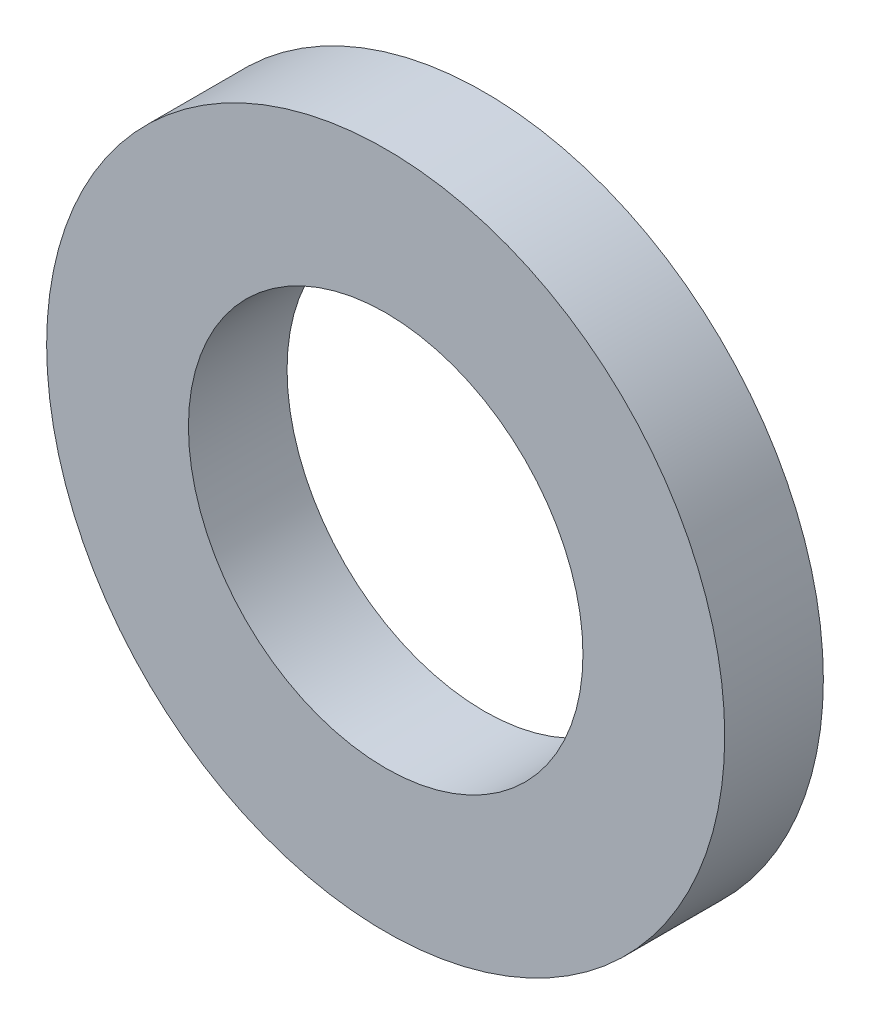
ISO-10303-21;
HEADER;
FILE_DESCRIPTION(('STEP AP214'),'2;1');
FILE_NAME('part.step','',(''),(''),'','','');
FILE_SCHEMA(('AUTOMOTIVE_DESIGN { 1 0 10303 214 1 1 1 1 }'));
ENDSEC;
DATA;
#1=APPLICATION_CONTEXT('core data for automotive mechanical design processes');
#2=APPLICATION_PROTOCOL_DEFINITION('international standard','automotive_design',2000,#1);
#3=PRODUCT_CONTEXT('',#1,'mechanical');
#4=PRODUCT('Part','Part','',(#3));
#5=PRODUCT_RELATED_PRODUCT_CATEGORY('part','',(#4));
#6=PRODUCT_DEFINITION_FORMATION('','',#4);
#7=PRODUCT_DEFINITION_CONTEXT('part definition',#1,'design');
#8=PRODUCT_DEFINITION('design','',#6,#7);
#9=PRODUCT_DEFINITION_SHAPE('','',#8);
#10=(LENGTH_UNIT() NAMED_UNIT(*) SI_UNIT(.MILLI.,.METRE.));
#11=(NAMED_UNIT(*) PLANE_ANGLE_UNIT() SI_UNIT($,.RADIAN.));
#12=(NAMED_UNIT(*) SI_UNIT($,.STERADIAN.) SOLID_ANGLE_UNIT());
#13=UNCERTAINTY_MEASURE_WITH_UNIT(LENGTH_MEASURE(1.E-05),#10,'distance_accuracy_value','');
#14=(GEOMETRIC_REPRESENTATION_CONTEXT(3) GLOBAL_UNCERTAINTY_ASSIGNED_CONTEXT((#13)) GLOBAL_UNIT_ASSIGNED_CONTEXT((#10,
#11,#12)) REPRESENTATION_CONTEXT('',''));
#15=CARTESIAN_POINT('',(0.,0.,0.));
#16=DIRECTION('',(0.,0.,1.));
#17=DIRECTION('',(1.,0.,0.));
#18=AXIS2_PLACEMENT_3D('',#15,#16,#17);
#19=CARTESIAN_POINT('',(0.,0.,1.6));
#20=DIRECTION('',(0.,0.,1.));
#21=DIRECTION('',(1.,0.,0.));
#22=AXIS2_PLACEMENT_3D('',#19,#20,#21);
#23=PLANE('',#22);
#24=CARTESIAN_POINT('',(0.,0.,1.6));
#25=DIRECTION('',(0.,0.,1.));
#26=DIRECTION('',(1.,0.,0.));
#27=AXIS2_PLACEMENT_3D('',#24,#25,#26);
#28=CIRCLE('',#27,5.5);
#29=CARTESIAN_POINT('',(5.5,0.,1.6));
#30=VERTEX_POINT('',#29);
#31=EDGE_CURVE('E10',#30,#30,#28,.T.);
#32=ORIENTED_EDGE('',*,*,#31,.T.);
#33=EDGE_LOOP('',(#32));
#34=FACE_BOUND('',#33,.T.);
#35=CARTESIAN_POINT('',(0.,0.,1.6));
#36=DIRECTION('',(0.,0.,1.));
#37=DIRECTION('',(1.,0.,0.));
#38=AXIS2_PLACEMENT_3D('',#35,#36,#37);
#39=CIRCLE('',#38,3.2);
#40=CARTESIAN_POINT('',(3.2,0.,1.6));
#41=VERTEX_POINT('',#40);
#42=EDGE_CURVE('E39',#41,#41,#39,.T.);
#43=ORIENTED_EDGE('',*,*,#42,.F.);
#44=EDGE_LOOP('',(#43));
#45=FACE_BOUND('',#44,.T.);
#46=ADVANCED_FACE('F28',(#34,#45),#23,.T.);
#47=CARTESIAN_POINT('',(0.,0.,0.));
#48=DIRECTION('',(0.,0.,1.));
#49=DIRECTION('',(1.,0.,0.));
#50=AXIS2_PLACEMENT_3D('',#47,#48,#49);
#51=PLANE('',#50);
#52=CARTESIAN_POINT('',(0.,0.,0.));
#53=DIRECTION('',(0.,0.,1.));
#54=DIRECTION('',(1.,0.,0.));
#55=AXIS2_PLACEMENT_3D('',#52,#53,#54);
#56=CIRCLE('',#55,5.5);
#57=CARTESIAN_POINT('',(5.5,0.,0.));
#58=VERTEX_POINT('',#57);
#59=EDGE_CURVE('E32',#58,#58,#56,.T.);
#60=ORIENTED_EDGE('',*,*,#59,.F.);
#61=EDGE_LOOP('',(#60));
#62=FACE_BOUND('',#61,.T.);
#63=CARTESIAN_POINT('',(0.,0.,0.));
#64=DIRECTION('',(0.,0.,1.));
#65=DIRECTION('',(1.,0.,0.));
#66=AXIS2_PLACEMENT_3D('',#63,#64,#65);
#67=CIRCLE('',#66,3.2);
#68=CARTESIAN_POINT('',(3.2,0.,0.));
#69=VERTEX_POINT('',#68);
#70=EDGE_CURVE('E41',#69,#69,#67,.T.);
#71=ORIENTED_EDGE('',*,*,#70,.T.);
#72=EDGE_LOOP('',(#71));
#73=FACE_BOUND('',#72,.T.);
#74=ADVANCED_FACE('F51',(#62,#73),#51,.F.);
#75=CARTESIAN_POINT('',(0.,0.,1.6));
#76=DIRECTION('',(0.,0.,-1.));
#77=DIRECTION('',(-1.,0.,0.));
#78=AXIS2_PLACEMENT_3D('',#75,#76,#77);
#79=CYLINDRICAL_SURFACE('',#78,5.5);
#80=ORIENTED_EDGE('',*,*,#31,.F.);
#81=EDGE_LOOP('',(#80));
#82=FACE_BOUND('',#81,.T.);
#83=ORIENTED_EDGE('',*,*,#59,.T.);
#84=EDGE_LOOP('',(#83));
#85=FACE_BOUND('',#84,.T.);
#86=ADVANCED_FACE('F30',(#82,#85),#79,.T.);
#87=CARTESIAN_POINT('',(0.,0.,1.6));
#88=DIRECTION('',(0.,0.,-1.));
#89=DIRECTION('',(-1.,0.,0.));
#90=AXIS2_PLACEMENT_3D('',#87,#88,#89);
#91=CYLINDRICAL_SURFACE('',#90,3.2);
#92=ORIENTED_EDGE('',*,*,#42,.T.);
#93=EDGE_LOOP('',(#92));
#94=FACE_BOUND('',#93,.T.);
#95=ORIENTED_EDGE('',*,*,#70,.F.);
#96=EDGE_LOOP('',(#95));
#97=FACE_BOUND('',#96,.T.);
#98=ADVANCED_FACE('F47',(#94,#97),#91,.F.);
#99=CLOSED_SHELL('',(#46,#74,#86,#98));
#100=MANIFOLD_SOLID_BREP('B2',#99);
#101=ADVANCED_BREP_SHAPE_REPRESENTATION('',(#18,#100),#14);
#102=SHAPE_DEFINITION_REPRESENTATION(#9,#101);
ENDSEC;
END-ISO-10303-21;
